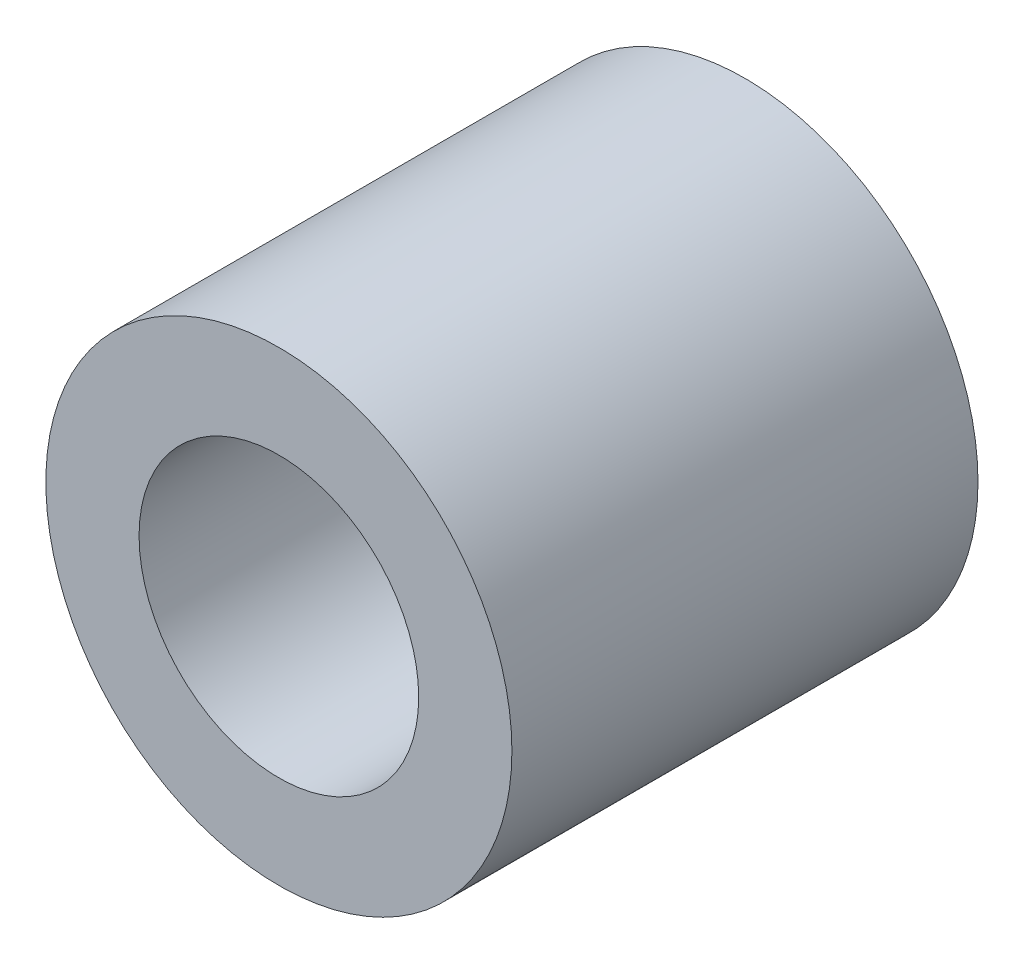
ISO-10303-21;
HEADER;
FILE_DESCRIPTION(('STEP AP214'),'2;1');
FILE_NAME('part.step','',(''),(''),'','','');
FILE_SCHEMA(('AUTOMOTIVE_DESIGN { 1 0 10303 214 1 1 1 1 }'));
ENDSEC;
DATA;
#1=APPLICATION_CONTEXT('core data for automotive mechanical design processes');
#2=APPLICATION_PROTOCOL_DEFINITION('international standard','automotive_design',2000,#1);
#3=PRODUCT_CONTEXT('',#1,'mechanical');
#4=PRODUCT('Part','Part','',(#3));
#5=PRODUCT_RELATED_PRODUCT_CATEGORY('part','',(#4));
#6=PRODUCT_DEFINITION_FORMATION('','',#4);
#7=PRODUCT_DEFINITION_CONTEXT('part definition',#1,'design');
#8=PRODUCT_DEFINITION('design','',#6,#7);
#9=PRODUCT_DEFINITION_SHAPE('','',#8);
#10=(LENGTH_UNIT() NAMED_UNIT(*) SI_UNIT(.MILLI.,.METRE.));
#11=(NAMED_UNIT(*) PLANE_ANGLE_UNIT() SI_UNIT($,.RADIAN.));
#12=(NAMED_UNIT(*) SI_UNIT($,.STERADIAN.) SOLID_ANGLE_UNIT());
#13=UNCERTAINTY_MEASURE_WITH_UNIT(LENGTH_MEASURE(1.E-05),#10,'distance_accuracy_value','');
#14=(GEOMETRIC_REPRESENTATION_CONTEXT(3) GLOBAL_UNCERTAINTY_ASSIGNED_CONTEXT((#13)) GLOBAL_UNIT_ASSIGNED_CONTEXT((#10,
#11,#12)) REPRESENTATION_CONTEXT('',''));
#15=CARTESIAN_POINT('',(0.,0.,0.));
#16=DIRECTION('',(0.,0.,1.));
#17=DIRECTION('',(1.,0.,0.));
#18=AXIS2_PLACEMENT_3D('',#15,#16,#17);
#19=CARTESIAN_POINT('',(0.,0.,10.));
#20=DIRECTION('',(0.,0.,1.));
#21=DIRECTION('',(1.,0.,0.));
#22=AXIS2_PLACEMENT_3D('',#19,#20,#21);
#23=PLANE('',#22);
#24=CARTESIAN_POINT('',(0.,0.,10.));
#25=DIRECTION('',(0.,0.,1.));
#26=DIRECTION('',(1.,0.,0.));
#27=AXIS2_PLACEMENT_3D('',#24,#25,#26);
#28=CIRCLE('',#27,5.);
#29=CARTESIAN_POINT('',(5.,0.,10.));
#30=VERTEX_POINT('',#29);
#31=EDGE_CURVE('E10',#30,#30,#28,.T.);
#32=ORIENTED_EDGE('',*,*,#31,.T.);
#33=EDGE_LOOP('',(#32));
#34=FACE_BOUND('',#33,.T.);
#35=CARTESIAN_POINT('',(0.,0.,10.));
#36=DIRECTION('',(0.,0.,1.));
#37=DIRECTION('',(1.,0.,0.));
#38=AXIS2_PLACEMENT_3D('',#35,#36,#37);
#39=CIRCLE('',#38,3.);
#40=CARTESIAN_POINT('',(3.,0.,10.));
#41=VERTEX_POINT('',#40);
#42=EDGE_CURVE('E48',#41,#41,#39,.T.);
#43=ORIENTED_EDGE('',*,*,#42,.F.);
#44=EDGE_LOOP('',(#43));
#45=FACE_BOUND('',#44,.T.);
#46=ADVANCED_FACE('F40',(#34,#45),#23,.T.);
#47=CARTESIAN_POINT('',(0.,0.,0.));
#48=DIRECTION('',(0.,0.,1.));
#49=DIRECTION('',(1.,0.,0.));
#50=AXIS2_PLACEMENT_3D('',#47,#48,#49);
#51=PLANE('',#50);
#52=CARTESIAN_POINT('',(0.,0.,0.));
#53=DIRECTION('',(0.,0.,1.));
#54=DIRECTION('',(1.,0.,0.));
#55=AXIS2_PLACEMENT_3D('',#52,#53,#54);
#56=CIRCLE('',#55,5.);
#57=CARTESIAN_POINT('',(5.,0.,0.));
#58=VERTEX_POINT('',#57);
#59=EDGE_CURVE('E41',#58,#58,#56,.T.);
#60=ORIENTED_EDGE('',*,*,#59,.F.);
#61=EDGE_LOOP('',(#60));
#62=FACE_BOUND('',#61,.T.);
#63=CARTESIAN_POINT('',(0.,0.,0.));
#64=DIRECTION('',(0.,0.,1.));
#65=DIRECTION('',(1.,0.,0.));
#66=AXIS2_PLACEMENT_3D('',#63,#64,#65);
#67=CIRCLE('',#66,3.);
#68=CARTESIAN_POINT('',(3.,0.,0.));
#69=VERTEX_POINT('',#68);
#70=EDGE_CURVE('E49',#69,#69,#67,.T.);
#71=ORIENTED_EDGE('',*,*,#70,.T.);
#72=EDGE_LOOP('',(#71));
#73=FACE_BOUND('',#72,.T.);
#74=ADVANCED_FACE('F58',(#62,#73),#51,.F.);
#75=CARTESIAN_POINT('',(0.,0.,10.));
#76=DIRECTION('',(0.,0.,-1.));
#77=DIRECTION('',(-1.,0.,0.));
#78=AXIS2_PLACEMENT_3D('',#75,#76,#77);
#79=CYLINDRICAL_SURFACE('',#78,5.);
#80=ORIENTED_EDGE('',*,*,#31,.F.);
#81=EDGE_LOOP('',(#80));
#82=FACE_BOUND('',#81,.T.);
#83=ORIENTED_EDGE('',*,*,#59,.T.);
#84=EDGE_LOOP('',(#83));
#85=FACE_BOUND('',#84,.T.);
#86=ADVANCED_FACE('F39',(#82,#85),#79,.T.);
#87=CARTESIAN_POINT('',(0.,0.,10.));
#88=DIRECTION('',(0.,0.,-1.));
#89=DIRECTION('',(-1.,0.,0.));
#90=AXIS2_PLACEMENT_3D('',#87,#88,#89);
#91=CYLINDRICAL_SURFACE('',#90,3.);
#92=ORIENTED_EDGE('',*,*,#42,.T.);
#93=EDGE_LOOP('',(#92));
#94=FACE_BOUND('',#93,.T.);
#95=ORIENTED_EDGE('',*,*,#70,.F.);
#96=EDGE_LOOP('',(#95));
#97=FACE_BOUND('',#96,.T.);
#98=ADVANCED_FACE('F57',(#94,#97),#91,.F.);
#99=CLOSED_SHELL('',(#46,#74,#86,#98));
#100=MANIFOLD_SOLID_BREP('B2',#99);
#101=ADVANCED_BREP_SHAPE_REPRESENTATION('',(#18,#100),#14);
#102=SHAPE_DEFINITION_REPRESENTATION(#9,#101);
ENDSEC;
END-ISO-10303-21;
